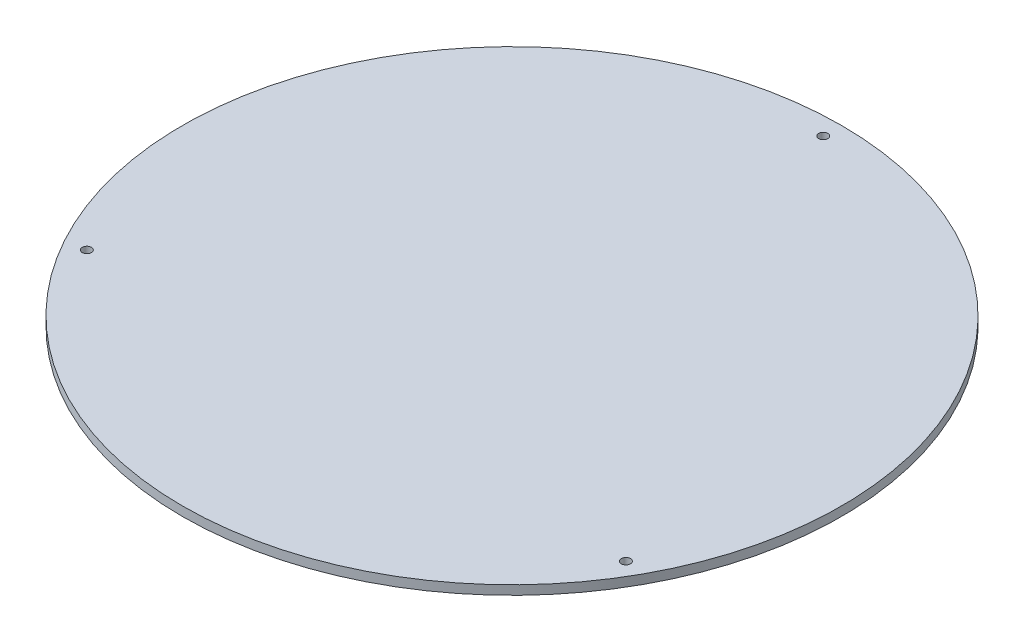
ISO-10303-21;
HEADER;
FILE_DESCRIPTION(('STEP AP214'),'2;1');
FILE_NAME('part.step','',(''),(''),'','','');
FILE_SCHEMA(('AUTOMOTIVE_DESIGN { 1 0 10303 214 1 1 1 1 }'));
ENDSEC;
DATA;
#1=APPLICATION_CONTEXT('core data for automotive mechanical design processes');
#2=APPLICATION_PROTOCOL_DEFINITION('international standard','automotive_design',2000,#1);
#3=PRODUCT_CONTEXT('',#1,'mechanical');
#4=PRODUCT('Part','Part','',(#3));
#5=PRODUCT_RELATED_PRODUCT_CATEGORY('part','',(#4));
#6=PRODUCT_DEFINITION_FORMATION('','',#4);
#7=PRODUCT_DEFINITION_CONTEXT('part definition',#1,'design');
#8=PRODUCT_DEFINITION('design','',#6,#7);
#9=PRODUCT_DEFINITION_SHAPE('','',#8);
#10=(LENGTH_UNIT() NAMED_UNIT(*) SI_UNIT(.MILLI.,.METRE.));
#11=(NAMED_UNIT(*) PLANE_ANGLE_UNIT() SI_UNIT($,.RADIAN.));
#12=(NAMED_UNIT(*) SI_UNIT($,.STERADIAN.) SOLID_ANGLE_UNIT());
#13=UNCERTAINTY_MEASURE_WITH_UNIT(LENGTH_MEASURE(1.E-05),#10,'distance_accuracy_value','');
#14=(GEOMETRIC_REPRESENTATION_CONTEXT(3) GLOBAL_UNCERTAINTY_ASSIGNED_CONTEXT((#13)) GLOBAL_UNIT_ASSIGNED_CONTEXT((#10,
#11,#12)) REPRESENTATION_CONTEXT('',''));
#15=CARTESIAN_POINT('',(0.,0.,0.));
#16=DIRECTION('',(0.,0.,1.));
#17=DIRECTION('',(1.,0.,0.));
#18=AXIS2_PLACEMENT_3D('',#15,#16,#17);
#19=CARTESIAN_POINT('',(0.,6.35,0.));
#20=DIRECTION('',(0.,-1.,0.));
#21=DIRECTION('',(0.,0.,-1.));
#22=AXIS2_PLACEMENT_3D('',#19,#20,#21);
#23=CYLINDRICAL_SURFACE('',#22,228.6);
#24=CARTESIAN_POINT('',(0.,6.35,0.));
#25=DIRECTION('',(0.,1.,0.));
#26=DIRECTION('',(0.,0.,1.));
#27=AXIS2_PLACEMENT_3D('',#24,#25,#26);
#28=CIRCLE('',#27,228.6);
#29=CARTESIAN_POINT('',(0.,6.35,228.6));
#30=VERTEX_POINT('',#29);
#31=EDGE_CURVE('E10',#30,#30,#28,.T.);
#32=ORIENTED_EDGE('',*,*,#31,.F.);
#33=EDGE_LOOP('',(#32));
#34=FACE_BOUND('',#33,.T.);
#35=CARTESIAN_POINT('',(0.,0.,0.));
#36=DIRECTION('',(0.,1.,0.));
#37=DIRECTION('',(0.,0.,1.));
#38=AXIS2_PLACEMENT_3D('',#35,#36,#37);
#39=CIRCLE('',#38,228.6);
#40=CARTESIAN_POINT('',(0.,0.,228.6));
#41=VERTEX_POINT('',#40);
#42=EDGE_CURVE('E40',#41,#41,#39,.T.);
#43=ORIENTED_EDGE('',*,*,#42,.T.);
#44=EDGE_LOOP('',(#43));
#45=FACE_BOUND('',#44,.T.);
#46=ADVANCED_FACE('F37',(#34,#45),#23,.T.);
#47=CARTESIAN_POINT('',(0.,6.35,0.));
#48=DIRECTION('',(0.,1.,0.));
#49=DIRECTION('',(0.,0.,1.));
#50=AXIS2_PLACEMENT_3D('',#47,#48,#49);
#51=PLANE('',#50);
#52=CARTESIAN_POINT('',(0.,6.35,-215.9));
#53=DIRECTION('',(0.,1.,0.));
#54=DIRECTION('',(0.,0.,1.));
#55=AXIS2_PLACEMENT_3D('',#52,#53,#54);
#56=CIRCLE('',#55,3.175);
#57=CARTESIAN_POINT('',(0.,6.35,-212.725));
#58=VERTEX_POINT('',#57);
#59=EDGE_CURVE('E47',#58,#58,#56,.T.);
#60=ORIENTED_EDGE('',*,*,#59,.F.);
#61=EDGE_LOOP('',(#60));
#62=FACE_BOUND('',#61,.T.);
#63=CARTESIAN_POINT('',(-186.97488467706,6.35,107.95));
#64=DIRECTION('',(0.,1.,0.));
#65=DIRECTION('',(0.,0.,1.));
#66=AXIS2_PLACEMENT_3D('',#63,#64,#65);
#67=CIRCLE('',#66,3.175);
#68=CARTESIAN_POINT('',(-186.97488467706,6.35,111.125));
#69=VERTEX_POINT('',#68);
#70=EDGE_CURVE('E51',#69,#69,#67,.T.);
#71=ORIENTED_EDGE('',*,*,#70,.F.);
#72=EDGE_LOOP('',(#71));
#73=FACE_BOUND('',#72,.T.);
#74=CARTESIAN_POINT('',(186.97488467706,6.35,107.95));
#75=DIRECTION('',(0.,1.,0.));
#76=DIRECTION('',(0.,0.,1.));
#77=AXIS2_PLACEMENT_3D('',#74,#75,#76);
#78=CIRCLE('',#77,3.175);
#79=CARTESIAN_POINT('',(186.97488467706,6.35,111.125));
#80=VERTEX_POINT('',#79);
#81=EDGE_CURVE('E54',#80,#80,#78,.T.);
#82=ORIENTED_EDGE('',*,*,#81,.F.);
#83=EDGE_LOOP('',(#82));
#84=FACE_BOUND('',#83,.T.);
#85=ORIENTED_EDGE('',*,*,#31,.T.);
#86=EDGE_LOOP('',(#85));
#87=FACE_BOUND('',#86,.T.);
#88=ADVANCED_FACE('F82',(#62,#73,#84,#87),#51,.T.);
#89=CARTESIAN_POINT('',(0.,0.,0.));
#90=DIRECTION('',(0.,1.,0.));
#91=DIRECTION('',(0.,0.,1.));
#92=AXIS2_PLACEMENT_3D('',#89,#90,#91);
#93=PLANE('',#92);
#94=CARTESIAN_POINT('',(0.,0.,-215.9));
#95=DIRECTION('',(0.,1.,0.));
#96=DIRECTION('',(0.,0.,1.));
#97=AXIS2_PLACEMENT_3D('',#94,#95,#96);
#98=CIRCLE('',#97,3.175);
#99=CARTESIAN_POINT('',(0.,0.,-212.725));
#100=VERTEX_POINT('',#99);
#101=EDGE_CURVE('E57',#100,#100,#98,.T.);
#102=ORIENTED_EDGE('',*,*,#101,.T.);
#103=EDGE_LOOP('',(#102));
#104=FACE_BOUND('',#103,.T.);
#105=CARTESIAN_POINT('',(-186.97488467706,0.,107.95));
#106=DIRECTION('',(0.,1.,0.));
#107=DIRECTION('',(0.,0.,1.));
#108=AXIS2_PLACEMENT_3D('',#105,#106,#107);
#109=CIRCLE('',#108,3.175);
#110=CARTESIAN_POINT('',(-186.97488467706,0.,111.125));
#111=VERTEX_POINT('',#110);
#112=EDGE_CURVE('E61',#111,#111,#109,.T.);
#113=ORIENTED_EDGE('',*,*,#112,.T.);
#114=EDGE_LOOP('',(#113));
#115=FACE_BOUND('',#114,.T.);
#116=CARTESIAN_POINT('',(186.97488467706,0.,107.95));
#117=DIRECTION('',(0.,1.,0.));
#118=DIRECTION('',(0.,0.,1.));
#119=AXIS2_PLACEMENT_3D('',#116,#117,#118);
#120=CIRCLE('',#119,3.175);
#121=CARTESIAN_POINT('',(186.97488467706,0.,111.125));
#122=VERTEX_POINT('',#121);
#123=EDGE_CURVE('E58',#122,#122,#120,.T.);
#124=ORIENTED_EDGE('',*,*,#123,.T.);
#125=EDGE_LOOP('',(#124));
#126=FACE_BOUND('',#125,.T.);
#127=ORIENTED_EDGE('',*,*,#42,.F.);
#128=EDGE_LOOP('',(#127));
#129=FACE_BOUND('',#128,.T.);
#130=ADVANCED_FACE('F67',(#104,#115,#126,#129),#93,.F.);
#131=CARTESIAN_POINT('',(186.97488467706,0.,107.95));
#132=DIRECTION('',(0.,1.,0.));
#133=DIRECTION('',(0.,0.,1.));
#134=AXIS2_PLACEMENT_3D('',#131,#132,#133);
#135=CYLINDRICAL_SURFACE('',#134,3.175);
#136=ORIENTED_EDGE('',*,*,#81,.T.);
#137=EDGE_LOOP('',(#136));
#138=FACE_BOUND('',#137,.T.);
#139=ORIENTED_EDGE('',*,*,#123,.F.);
#140=EDGE_LOOP('',(#139));
#141=FACE_BOUND('',#140,.T.);
#142=ADVANCED_FACE('F78',(#138,#141),#135,.F.);
#143=CARTESIAN_POINT('',(-186.97488467706,0.,107.95));
#144=DIRECTION('',(0.,1.,0.));
#145=DIRECTION('',(0.,0.,1.));
#146=AXIS2_PLACEMENT_3D('',#143,#144,#145);
#147=CYLINDRICAL_SURFACE('',#146,3.175);
#148=ORIENTED_EDGE('',*,*,#70,.T.);
#149=EDGE_LOOP('',(#148));
#150=FACE_BOUND('',#149,.T.);
#151=ORIENTED_EDGE('',*,*,#112,.F.);
#152=EDGE_LOOP('',(#151));
#153=FACE_BOUND('',#152,.T.);
#154=ADVANCED_FACE('F72',(#150,#153),#147,.F.);
#155=CARTESIAN_POINT('',(0.,0.,-215.9));
#156=DIRECTION('',(0.,1.,0.));
#157=DIRECTION('',(0.,0.,1.));
#158=AXIS2_PLACEMENT_3D('',#155,#156,#157);
#159=CYLINDRICAL_SURFACE('',#158,3.175);
#160=ORIENTED_EDGE('',*,*,#59,.T.);
#161=EDGE_LOOP('',(#160));
#162=FACE_BOUND('',#161,.T.);
#163=ORIENTED_EDGE('',*,*,#101,.F.);
#164=EDGE_LOOP('',(#163));
#165=FACE_BOUND('',#164,.T.);
#166=ADVANCED_FACE('F70',(#162,#165),#159,.F.);
#167=CLOSED_SHELL('',(#46,#88,#130,#142,#154,#166));
#168=MANIFOLD_SOLID_BREP('B2',#167);
#169=ADVANCED_BREP_SHAPE_REPRESENTATION('',(#18,#168),#14);
#170=SHAPE_DEFINITION_REPRESENTATION(#9,#169);
ENDSEC;
END-ISO-10303-21;
